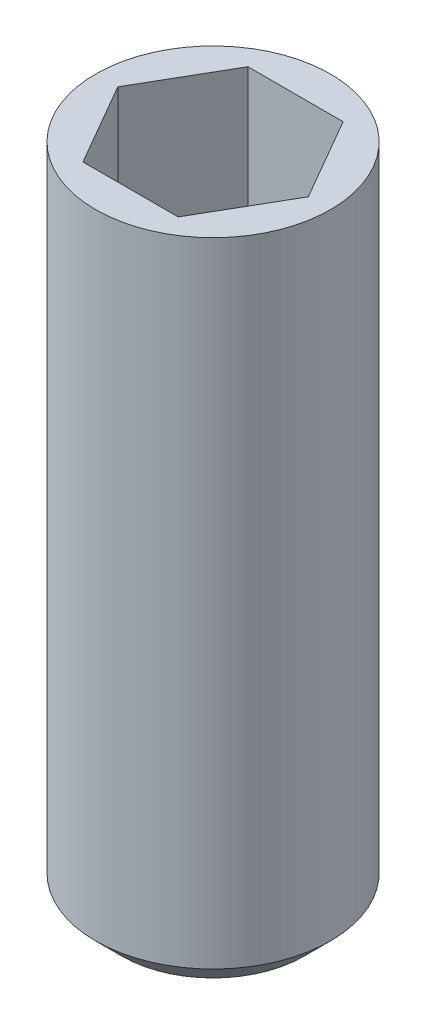
ISO-10303-21;
HEADER;
FILE_DESCRIPTION(('STEP AP214'),'2;1');
FILE_NAME('part.step','',(''),(''),'','','');
FILE_SCHEMA(('AUTOMOTIVE_DESIGN { 1 0 10303 214 1 1 1 1 }'));
ENDSEC;
DATA;
#1=APPLICATION_CONTEXT('core data for automotive mechanical design processes');
#2=APPLICATION_PROTOCOL_DEFINITION('international standard','automotive_design',2000,#1);
#3=PRODUCT_CONTEXT('',#1,'mechanical');
#4=PRODUCT('Part','Part','',(#3));
#5=PRODUCT_RELATED_PRODUCT_CATEGORY('part','',(#4));
#6=PRODUCT_DEFINITION_FORMATION('','',#4);
#7=PRODUCT_DEFINITION_CONTEXT('part definition',#1,'design');
#8=PRODUCT_DEFINITION('design','',#6,#7);
#9=PRODUCT_DEFINITION_SHAPE('','',#8);
#10=(LENGTH_UNIT() NAMED_UNIT(*) SI_UNIT(.MILLI.,.METRE.));
#11=(NAMED_UNIT(*) PLANE_ANGLE_UNIT() SI_UNIT($,.RADIAN.));
#12=(NAMED_UNIT(*) SI_UNIT($,.STERADIAN.) SOLID_ANGLE_UNIT());
#13=UNCERTAINTY_MEASURE_WITH_UNIT(LENGTH_MEASURE(1.E-05),#10,'distance_accuracy_value','');
#14=(GEOMETRIC_REPRESENTATION_CONTEXT(3) GLOBAL_UNCERTAINTY_ASSIGNED_CONTEXT((#13)) GLOBAL_UNIT_ASSIGNED_CONTEXT((#10,
#11,#12)) REPRESENTATION_CONTEXT('',''));
#15=CARTESIAN_POINT('',(0.,0.,0.));
#16=DIRECTION('',(0.,0.,1.));
#17=DIRECTION('',(1.,0.,0.));
#18=AXIS2_PLACEMENT_3D('',#15,#16,#17);
#19=CARTESIAN_POINT('',(0.,-6.35,0.));
#20=DIRECTION('',(0.,1.,0.));
#21=DIRECTION('',(0.,0.,1.));
#22=AXIS2_PLACEMENT_3D('',#19,#20,#21);
#23=CYLINDRICAL_SURFACE('',#22,1.1303);
#24=CARTESIAN_POINT('',(0.,-6.096,0.));
#25=DIRECTION('',(0.,1.,0.));
#26=DIRECTION('',(0.,0.,1.));
#27=AXIS2_PLACEMENT_3D('',#24,#25,#26);
#28=CIRCLE('',#27,1.1303);
#29=CARTESIAN_POINT('',(0.,-6.096,1.1303));
#30=VERTEX_POINT('',#29);
#31=EDGE_CURVE('E41',#30,#30,#28,.T.);
#32=ORIENTED_EDGE('',*,*,#31,.T.);
#33=EDGE_LOOP('',(#32));
#34=FACE_BOUND('',#33,.T.);
#35=CARTESIAN_POINT('',(0.,0.,0.));
#36=DIRECTION('',(0.,1.,0.));
#37=DIRECTION('',(0.,0.,1.));
#38=AXIS2_PLACEMENT_3D('',#35,#36,#37);
#39=CIRCLE('',#38,1.1303);
#40=CARTESIAN_POINT('',(0.,0.,1.1303));
#41=VERTEX_POINT('',#40);
#42=EDGE_CURVE('E135',#41,#41,#39,.T.);
#43=ORIENTED_EDGE('',*,*,#42,.F.);
#44=EDGE_LOOP('',(#43));
#45=FACE_BOUND('',#44,.T.);
#46=ADVANCED_FACE('F33',(#34,#45),#23,.T.);
#47=CARTESIAN_POINT('',(0.,-6.35,0.));
#48=DIRECTION('',(0.,1.,0.));
#49=DIRECTION('',(0.,0.,1.));
#50=AXIS2_PLACEMENT_3D('',#47,#48,#49);
#51=PLANE('',#50);
#52=CARTESIAN_POINT('',(0.,-6.35,0.));
#53=DIRECTION('',(0.,1.,0.));
#54=DIRECTION('',(0.,0.,1.));
#55=AXIS2_PLACEMENT_3D('',#52,#53,#54);
#56=CIRCLE('',#55,0.876299999999999);
#57=CARTESIAN_POINT('',(0.,-6.35,0.876299999999999));
#58=VERTEX_POINT('',#57);
#59=EDGE_CURVE('E11',#58,#58,#56,.F.);
#60=ORIENTED_EDGE('',*,*,#59,.T.);
#61=EDGE_LOOP('',(#60));
#62=FACE_BOUND('',#61,.T.);
#63=ADVANCED_FACE('F157',(#62),#51,.F.);
#64=CARTESIAN_POINT('',(0.,0.,0.));
#65=DIRECTION('',(0.,1.,0.));
#66=DIRECTION('',(0.,0.,1.));
#67=AXIS2_PLACEMENT_3D('',#64,#65,#66);
#68=PLANE('',#67);
#69=DIRECTION('',(-0.5,0.,0.866025403784439));
#70=VECTOR('',#69,1.);
#71=CARTESIAN_POINT('',(-0.458271776169265,0.,-0.79375));
#72=LINE('',#71,#70);
#73=CARTESIAN_POINT('',(-0.458271776169265,0.,-0.79375));
#74=VERTEX_POINT('',#73);
#75=CARTESIAN_POINT('',(-0.91654355233853,0.,0.));
#76=VERTEX_POINT('',#75);
#77=EDGE_CURVE('E48',#74,#76,#72,.T.);
#78=ORIENTED_EDGE('',*,*,#77,.F.);
#79=DIRECTION('',(-1.,0.,0.));
#80=VECTOR('',#79,1.);
#81=CARTESIAN_POINT('',(0.458271776169266,0.,-0.79375));
#82=LINE('',#81,#80);
#83=CARTESIAN_POINT('',(0.458271776169266,0.,-0.79375));
#84=VERTEX_POINT('',#83);
#85=EDGE_CURVE('E131',#84,#74,#82,.T.);
#86=ORIENTED_EDGE('',*,*,#85,.F.);
#87=DIRECTION('',(-0.5,0.,-0.866025403784439));
#88=VECTOR('',#87,1.);
#89=CARTESIAN_POINT('',(0.916543552338531,0.,0.));
#90=LINE('',#89,#88);
#91=CARTESIAN_POINT('',(0.916543552338531,0.,0.));
#92=VERTEX_POINT('',#91);
#93=EDGE_CURVE('E129',#92,#84,#90,.T.);
#94=ORIENTED_EDGE('',*,*,#93,.F.);
#95=DIRECTION('',(0.5,0.,-0.866025403784439));
#96=VECTOR('',#95,1.);
#97=CARTESIAN_POINT('',(0.458271776169265,0.,0.79375));
#98=LINE('',#97,#96);
#99=CARTESIAN_POINT('',(0.458271776169265,0.,0.79375));
#100=VERTEX_POINT('',#99);
#101=EDGE_CURVE('E96',#100,#92,#98,.T.);
#102=ORIENTED_EDGE('',*,*,#101,.F.);
#103=DIRECTION('',(1.,0.,0.));
#104=VECTOR('',#103,1.);
#105=CARTESIAN_POINT('',(-0.458271776169266,0.,0.79375));
#106=LINE('',#105,#104);
#107=CARTESIAN_POINT('',(-0.458271776169266,0.,0.79375));
#108=VERTEX_POINT('',#107);
#109=EDGE_CURVE('E125',#108,#100,#106,.T.);
#110=ORIENTED_EDGE('',*,*,#109,.F.);
#111=DIRECTION('',(0.5,0.,0.866025403784439));
#112=VECTOR('',#111,1.);
#113=CARTESIAN_POINT('',(-0.916543552338531,0.,0.));
#114=LINE('',#113,#112);
#115=EDGE_CURVE('E122',#76,#108,#114,.T.);
#116=ORIENTED_EDGE('',*,*,#115,.F.);
#117=EDGE_LOOP('',(#78,#86,#94,#102,#110,#116));
#118=FACE_BOUND('',#117,.T.);
#119=ORIENTED_EDGE('',*,*,#42,.T.);
#120=EDGE_LOOP('',(#119));
#121=FACE_BOUND('',#120,.T.);
#122=ADVANCED_FACE('F149',(#118,#121),#68,.T.);
#123=CARTESIAN_POINT('',(0.,-6.096,0.));
#124=DIRECTION('',(0.,1.,0.));
#125=DIRECTION('',(0.,0.,1.));
#126=AXIS2_PLACEMENT_3D('',#123,#124,#125);
#127=CONICAL_SURFACE('',#126,1.1303,0.78539816339745);
#128=ORIENTED_EDGE('',*,*,#59,.F.);
#129=EDGE_LOOP('',(#128));
#130=FACE_BOUND('',#129,.T.);
#131=ORIENTED_EDGE('',*,*,#31,.F.);
#132=EDGE_LOOP('',(#131));
#133=FACE_BOUND('',#132,.T.);
#134=ADVANCED_FACE('F35',(#130,#133),#127,.T.);
#135=CARTESIAN_POINT('',(-0.458271776169265,-1.27,-0.79375));
#136=DIRECTION('',(-0.866025403784439,0.,-0.5));
#137=DIRECTION('',(-0.5,0.,0.866025403784439));
#138=AXIS2_PLACEMENT_3D('',#135,#136,#137);
#139=PLANE('',#138);
#140=ORIENTED_EDGE('',*,*,#77,.T.);
#141=DIRECTION('',(0.,1.,0.));
#142=VECTOR('',#141,1.);
#143=CARTESIAN_POINT('',(-0.916543552338531,-1.27,0.));
#144=LINE('',#143,#142);
#145=CARTESIAN_POINT('',(-0.916543552338531,-1.27,0.));
#146=VERTEX_POINT('',#145);
#147=EDGE_CURVE('E78',#146,#76,#144,.T.);
#148=ORIENTED_EDGE('',*,*,#147,.F.);
#149=DIRECTION('',(-0.5,0.,0.866025403784439));
#150=VECTOR('',#149,1.);
#151=CARTESIAN_POINT('',(-0.458271776169265,-1.27,-0.79375));
#152=LINE('',#151,#150);
#153=CARTESIAN_POINT('',(-0.458271776169265,-1.27,-0.79375));
#154=VERTEX_POINT('',#153);
#155=EDGE_CURVE('E133',#154,#146,#152,.T.);
#156=ORIENTED_EDGE('',*,*,#155,.F.);
#157=DIRECTION('',(0.,1.,0.));
#158=VECTOR('',#157,1.);
#159=CARTESIAN_POINT('',(-0.458271776169265,-1.27,-0.79375));
#160=LINE('',#159,#158);
#161=EDGE_CURVE('E56',#154,#74,#160,.T.);
#162=ORIENTED_EDGE('',*,*,#161,.T.);
#163=EDGE_LOOP('',(#140,#148,#156,#162));
#164=FACE_BOUND('',#163,.T.);
#165=ADVANCED_FACE('F148',(#164),#139,.F.);
#166=CARTESIAN_POINT('',(0.458271776169266,-1.27,-0.79375));
#167=DIRECTION('',(0.,0.,-1.));
#168=DIRECTION('',(-1.,0.,0.));
#169=AXIS2_PLACEMENT_3D('',#166,#167,#168);
#170=PLANE('',#169);
#171=ORIENTED_EDGE('',*,*,#85,.T.);
#172=ORIENTED_EDGE('',*,*,#161,.F.);
#173=DIRECTION('',(-1.,0.,0.));
#174=VECTOR('',#173,1.);
#175=CARTESIAN_POINT('',(0.458271776169266,-1.27,-0.79375));
#176=LINE('',#175,#174);
#177=CARTESIAN_POINT('',(0.458271776169266,-1.27,-0.79375));
#178=VERTEX_POINT('',#177);
#179=EDGE_CURVE('E108',#178,#154,#176,.T.);
#180=ORIENTED_EDGE('',*,*,#179,.F.);
#181=DIRECTION('',(0.,1.,0.));
#182=VECTOR('',#181,1.);
#183=CARTESIAN_POINT('',(0.458271776169266,-1.27,-0.79375));
#184=LINE('',#183,#182);
#185=EDGE_CURVE('E100',#178,#84,#184,.T.);
#186=ORIENTED_EDGE('',*,*,#185,.T.);
#187=EDGE_LOOP('',(#171,#172,#180,#186));
#188=FACE_BOUND('',#187,.T.);
#189=ADVANCED_FACE('F155',(#188),#170,.F.);
#190=CARTESIAN_POINT('',(0.916543552338531,-1.27,0.));
#191=DIRECTION('',(0.866025403784439,0.,-0.5));
#192=DIRECTION('',(-0.5,0.,-0.866025403784439));
#193=AXIS2_PLACEMENT_3D('',#190,#191,#192);
#194=PLANE('',#193);
#195=ORIENTED_EDGE('',*,*,#93,.T.);
#196=ORIENTED_EDGE('',*,*,#185,.F.);
#197=DIRECTION('',(-0.5,0.,-0.866025403784439));
#198=VECTOR('',#197,1.);
#199=CARTESIAN_POINT('',(0.916543552338531,-1.27,0.));
#200=LINE('',#199,#198);
#201=CARTESIAN_POINT('',(0.916543552338531,-1.27,0.));
#202=VERTEX_POINT('',#201);
#203=EDGE_CURVE('E104',#202,#178,#200,.T.);
#204=ORIENTED_EDGE('',*,*,#203,.F.);
#205=DIRECTION('',(0.,1.,0.));
#206=VECTOR('',#205,1.);
#207=CARTESIAN_POINT('',(0.916543552338531,-1.27,0.));
#208=LINE('',#207,#206);
#209=EDGE_CURVE('E89',#202,#92,#208,.T.);
#210=ORIENTED_EDGE('',*,*,#209,.T.);
#211=EDGE_LOOP('',(#195,#196,#204,#210));
#212=FACE_BOUND('',#211,.T.);
#213=ADVANCED_FACE('F105',(#212),#194,.F.);
#214=CARTESIAN_POINT('',(0.458271776169265,-1.27,0.79375));
#215=DIRECTION('',(0.866025403784439,0.,0.5));
#216=DIRECTION('',(0.5,0.,-0.866025403784439));
#217=AXIS2_PLACEMENT_3D('',#214,#215,#216);
#218=PLANE('',#217);
#219=ORIENTED_EDGE('',*,*,#101,.T.);
#220=ORIENTED_EDGE('',*,*,#209,.F.);
#221=DIRECTION('',(0.5,0.,-0.866025403784439));
#222=VECTOR('',#221,1.);
#223=CARTESIAN_POINT('',(0.458271776169265,-1.27,0.79375));
#224=LINE('',#223,#222);
#225=CARTESIAN_POINT('',(0.458271776169265,-1.27,0.79375));
#226=VERTEX_POINT('',#225);
#227=EDGE_CURVE('E93',#226,#202,#224,.T.);
#228=ORIENTED_EDGE('',*,*,#227,.F.);
#229=DIRECTION('',(0.,1.,0.));
#230=VECTOR('',#229,1.);
#231=CARTESIAN_POINT('',(0.458271776169265,-1.27,0.79375));
#232=LINE('',#231,#230);
#233=EDGE_CURVE('E101',#226,#100,#232,.T.);
#234=ORIENTED_EDGE('',*,*,#233,.T.);
#235=EDGE_LOOP('',(#219,#220,#228,#234));
#236=FACE_BOUND('',#235,.T.);
#237=ADVANCED_FACE('F91',(#236),#218,.F.);
#238=CARTESIAN_POINT('',(-0.458271776169266,-1.27,0.79375));
#239=DIRECTION('',(0.,0.,1.));
#240=DIRECTION('',(1.,0.,0.));
#241=AXIS2_PLACEMENT_3D('',#238,#239,#240);
#242=PLANE('',#241);
#243=ORIENTED_EDGE('',*,*,#109,.T.);
#244=ORIENTED_EDGE('',*,*,#233,.F.);
#245=DIRECTION('',(1.,0.,0.));
#246=VECTOR('',#245,1.);
#247=CARTESIAN_POINT('',(-0.458271776169266,-1.27,0.79375));
#248=LINE('',#247,#246);
#249=CARTESIAN_POINT('',(-0.458271776169266,-1.27,0.79375));
#250=VERTEX_POINT('',#249);
#251=EDGE_CURVE('E114',#250,#226,#248,.T.);
#252=ORIENTED_EDGE('',*,*,#251,.F.);
#253=DIRECTION('',(0.,1.,0.));
#254=VECTOR('',#253,1.);
#255=CARTESIAN_POINT('',(-0.458271776169266,-1.27,0.79375));
#256=LINE('',#255,#254);
#257=EDGE_CURVE('E138',#250,#108,#256,.T.);
#258=ORIENTED_EDGE('',*,*,#257,.T.);
#259=EDGE_LOOP('',(#243,#244,#252,#258));
#260=FACE_BOUND('',#259,.T.);
#261=ADVANCED_FACE('F171',(#260),#242,.F.);
#262=CARTESIAN_POINT('',(-0.916543552338531,-1.27,0.));
#263=DIRECTION('',(-0.866025403784439,0.,0.5));
#264=DIRECTION('',(0.5,0.,0.866025403784439));
#265=AXIS2_PLACEMENT_3D('',#262,#263,#264);
#266=PLANE('',#265);
#267=ORIENTED_EDGE('',*,*,#115,.T.);
#268=ORIENTED_EDGE('',*,*,#257,.F.);
#269=DIRECTION('',(0.5,0.,0.866025403784439));
#270=VECTOR('',#269,1.);
#271=CARTESIAN_POINT('',(-0.916543552338531,-1.27,0.));
#272=LINE('',#271,#270);
#273=EDGE_CURVE('E116',#146,#250,#272,.T.);
#274=ORIENTED_EDGE('',*,*,#273,.F.);
#275=ORIENTED_EDGE('',*,*,#147,.T.);
#276=EDGE_LOOP('',(#267,#268,#274,#275));
#277=FACE_BOUND('',#276,.T.);
#278=ADVANCED_FACE('F168',(#277),#266,.F.);
#279=CARTESIAN_POINT('',(0.,-1.27,0.));
#280=DIRECTION('',(0.,1.,0.));
#281=DIRECTION('',(0.,0.,1.));
#282=AXIS2_PLACEMENT_3D('',#279,#280,#281);
#283=PLANE('',#282);
#284=ORIENTED_EDGE('',*,*,#155,.T.);
#285=ORIENTED_EDGE('',*,*,#273,.T.);
#286=ORIENTED_EDGE('',*,*,#251,.T.);
#287=ORIENTED_EDGE('',*,*,#227,.T.);
#288=ORIENTED_EDGE('',*,*,#203,.T.);
#289=ORIENTED_EDGE('',*,*,#179,.T.);
#290=EDGE_LOOP('',(#284,#285,#286,#287,#288,#289));
#291=FACE_BOUND('',#290,.T.);
#292=ADVANCED_FACE('F111',(#291),#283,.T.);
#293=CLOSED_SHELL('',(#46,#63,#122,#134,#165,#189,#213,#237,#261,#278,#292));
#294=MANIFOLD_SOLID_BREP('B2',#293);
#295=ADVANCED_BREP_SHAPE_REPRESENTATION('',(#18,#294),#14);
#296=SHAPE_DEFINITION_REPRESENTATION(#9,#295);
ENDSEC;
END-ISO-10303-21;
